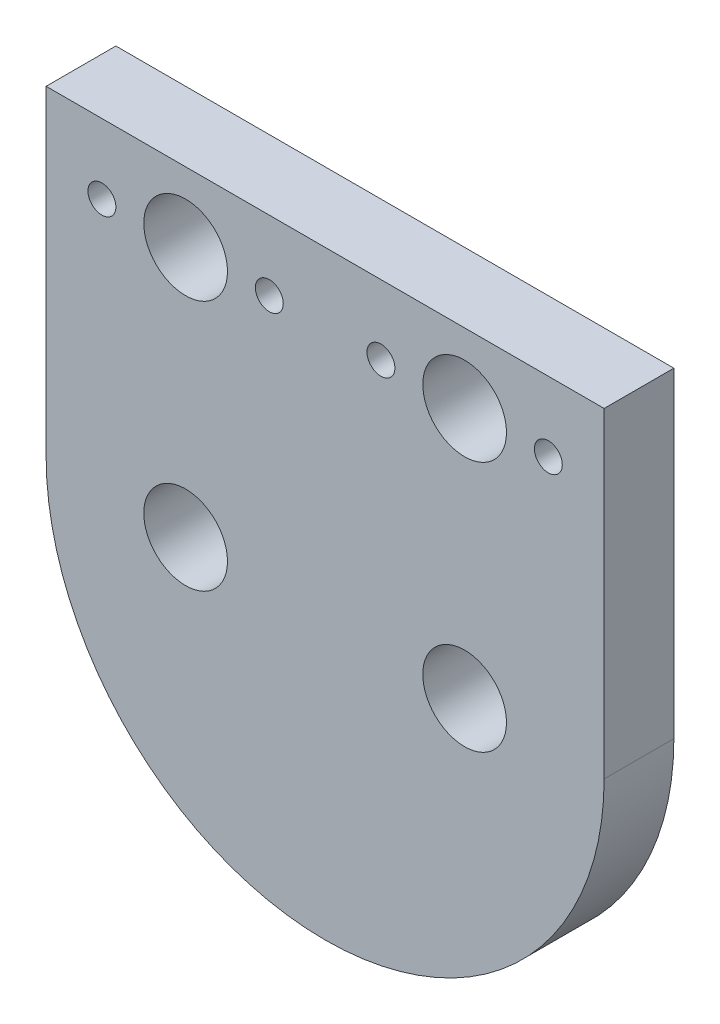
ISO-10303-21;
HEADER;
FILE_DESCRIPTION(('STEP AP214'),'2;1');
FILE_NAME('part.step','',(''),(''),'','','');
FILE_SCHEMA(('AUTOMOTIVE_DESIGN { 1 0 10303 214 1 1 1 1 }'));
ENDSEC;
DATA;
#1=APPLICATION_CONTEXT('core data for automotive mechanical design processes');
#2=APPLICATION_PROTOCOL_DEFINITION('international standard','automotive_design',2000,#1);
#3=PRODUCT_CONTEXT('',#1,'mechanical');
#4=PRODUCT('Part','Part','',(#3));
#5=PRODUCT_RELATED_PRODUCT_CATEGORY('part','',(#4));
#6=PRODUCT_DEFINITION_FORMATION('','',#4);
#7=PRODUCT_DEFINITION_CONTEXT('part definition',#1,'design');
#8=PRODUCT_DEFINITION('design','',#6,#7);
#9=PRODUCT_DEFINITION_SHAPE('','',#8);
#10=(LENGTH_UNIT() NAMED_UNIT(*) SI_UNIT(.MILLI.,.METRE.));
#11=(NAMED_UNIT(*) PLANE_ANGLE_UNIT() SI_UNIT($,.RADIAN.));
#12=(NAMED_UNIT(*) SI_UNIT($,.STERADIAN.) SOLID_ANGLE_UNIT());
#13=UNCERTAINTY_MEASURE_WITH_UNIT(LENGTH_MEASURE(1.E-05),#10,'distance_accuracy_value','');
#14=(GEOMETRIC_REPRESENTATION_CONTEXT(3) GLOBAL_UNCERTAINTY_ASSIGNED_CONTEXT((#13)) GLOBAL_UNIT_ASSIGNED_CONTEXT((#10,
#11,#12)) REPRESENTATION_CONTEXT('',''));
#15=CARTESIAN_POINT('',(0.,0.,0.));
#16=DIRECTION('',(0.,0.,1.));
#17=DIRECTION('',(1.,0.,0.));
#18=AXIS2_PLACEMENT_3D('',#15,#16,#17);
#19=CARTESIAN_POINT('',(0.,0.,5.));
#20=DIRECTION('',(0.,0.,1.));
#21=DIRECTION('',(1.,0.,0.));
#22=AXIS2_PLACEMENT_3D('',#19,#20,#21);
#23=PLANE('',#22);
#24=CARTESIAN_POINT('',(4.,18.,5.));
#25=DIRECTION('',(0.,0.,1.));
#26=DIRECTION('',(1.,0.,0.));
#27=AXIS2_PLACEMENT_3D('',#24,#25,#26);
#28=CIRCLE('',#27,1.);
#29=CARTESIAN_POINT('',(5.,18.,5.));
#30=VERTEX_POINT('',#29);
#31=EDGE_CURVE('E145',#30,#30,#28,.T.);
#32=ORIENTED_EDGE('',*,*,#31,.F.);
#33=EDGE_LOOP('',(#32));
#34=FACE_BOUND('',#33,.T.);
#35=CARTESIAN_POINT('',(-4.,18.,5.));
#36=DIRECTION('',(0.,0.,1.));
#37=DIRECTION('',(1.,0.,0.));
#38=AXIS2_PLACEMENT_3D('',#35,#36,#37);
#39=CIRCLE('',#38,1.);
#40=CARTESIAN_POINT('',(-3.,18.,5.));
#41=VERTEX_POINT('',#40);
#42=EDGE_CURVE('E133',#41,#41,#39,.T.);
#43=ORIENTED_EDGE('',*,*,#42,.F.);
#44=EDGE_LOOP('',(#43));
#45=FACE_BOUND('',#44,.T.);
#46=CARTESIAN_POINT('',(-10.,18.,5.));
#47=DIRECTION('',(0.,0.,1.));
#48=DIRECTION('',(1.,0.,0.));
#49=AXIS2_PLACEMENT_3D('',#46,#47,#48);
#50=CIRCLE('',#49,3.);
#51=CARTESIAN_POINT('',(-7.,18.,5.));
#52=VERTEX_POINT('',#51);
#53=EDGE_CURVE('E121',#52,#52,#50,.T.);
#54=ORIENTED_EDGE('',*,*,#53,.F.);
#55=EDGE_LOOP('',(#54));
#56=FACE_BOUND('',#55,.T.);
#57=CARTESIAN_POINT('',(10.,0.,5.));
#58=DIRECTION('',(0.,0.,1.));
#59=DIRECTION('',(1.,0.,0.));
#60=AXIS2_PLACEMENT_3D('',#57,#58,#59);
#61=CIRCLE('',#60,3.);
#62=CARTESIAN_POINT('',(13.,0.,5.));
#63=VERTEX_POINT('',#62);
#64=EDGE_CURVE('E100',#63,#63,#61,.T.);
#65=ORIENTED_EDGE('',*,*,#64,.F.);
#66=EDGE_LOOP('',(#65));
#67=FACE_BOUND('',#66,.T.);
#68=CARTESIAN_POINT('',(0.,0.,5.));
#69=DIRECTION('',(0.,0.,1.));
#70=DIRECTION('',(1.,0.,0.));
#71=AXIS2_PLACEMENT_3D('',#68,#69,#70);
#72=CIRCLE('',#71,20.);
#73=CARTESIAN_POINT('',(-20.,0.,5.));
#74=VERTEX_POINT('',#73);
#75=CARTESIAN_POINT('',(20.,0.,5.));
#76=VERTEX_POINT('',#75);
#77=EDGE_CURVE('E85',#74,#76,#72,.T.);
#78=ORIENTED_EDGE('',*,*,#77,.T.);
#79=DIRECTION('',(0.,1.,0.));
#80=VECTOR('',#79,1.);
#81=CARTESIAN_POINT('',(20.,0.,5.));
#82=LINE('',#81,#80);
#83=CARTESIAN_POINT('',(20.,23.,5.));
#84=VERTEX_POINT('',#83);
#85=EDGE_CURVE('E80',#76,#84,#82,.T.);
#86=ORIENTED_EDGE('',*,*,#85,.T.);
#87=DIRECTION('',(-1.,0.,0.));
#88=VECTOR('',#87,1.);
#89=CARTESIAN_POINT('',(-20.,23.,5.));
#90=LINE('',#89,#88);
#91=CARTESIAN_POINT('',(-20.,23.,5.));
#92=VERTEX_POINT('',#91);
#93=EDGE_CURVE('E83',#84,#92,#90,.T.);
#94=ORIENTED_EDGE('',*,*,#93,.T.);
#95=DIRECTION('',(0.,-1.,0.));
#96=VECTOR('',#95,1.);
#97=CARTESIAN_POINT('',(-20.,0.,5.));
#98=LINE('',#97,#96);
#99=EDGE_CURVE('E50',#92,#74,#98,.T.);
#100=ORIENTED_EDGE('',*,*,#99,.T.);
#101=EDGE_LOOP('',(#78,#86,#94,#100));
#102=FACE_BOUND('',#101,.T.);
#103=CARTESIAN_POINT('',(-10.,0.,5.));
#104=DIRECTION('',(0.,0.,1.));
#105=DIRECTION('',(1.,0.,0.));
#106=AXIS2_PLACEMENT_3D('',#103,#104,#105);
#107=CIRCLE('',#106,3.);
#108=CARTESIAN_POINT('',(-7.,0.,5.));
#109=VERTEX_POINT('',#108);
#110=EDGE_CURVE('E115',#109,#109,#107,.T.);
#111=ORIENTED_EDGE('',*,*,#110,.F.);
#112=EDGE_LOOP('',(#111));
#113=FACE_BOUND('',#112,.T.);
#114=CARTESIAN_POINT('',(10.,18.,5.));
#115=DIRECTION('',(0.,0.,1.));
#116=DIRECTION('',(1.,0.,0.));
#117=AXIS2_PLACEMENT_3D('',#114,#115,#116);
#118=CIRCLE('',#117,3.);
#119=CARTESIAN_POINT('',(13.,18.,5.));
#120=VERTEX_POINT('',#119);
#121=EDGE_CURVE('E127',#120,#120,#118,.T.);
#122=ORIENTED_EDGE('',*,*,#121,.F.);
#123=EDGE_LOOP('',(#122));
#124=FACE_BOUND('',#123,.T.);
#125=CARTESIAN_POINT('',(-16.,18.,5.));
#126=DIRECTION('',(0.,0.,1.));
#127=DIRECTION('',(1.,0.,0.));
#128=AXIS2_PLACEMENT_3D('',#125,#126,#127);
#129=CIRCLE('',#128,1.);
#130=CARTESIAN_POINT('',(-15.,18.,5.));
#131=VERTEX_POINT('',#130);
#132=EDGE_CURVE('E139',#131,#131,#129,.T.);
#133=ORIENTED_EDGE('',*,*,#132,.F.);
#134=EDGE_LOOP('',(#133));
#135=FACE_BOUND('',#134,.T.);
#136=CARTESIAN_POINT('',(16.,18.,5.));
#137=DIRECTION('',(0.,0.,1.));
#138=DIRECTION('',(1.,0.,0.));
#139=AXIS2_PLACEMENT_3D('',#136,#137,#138);
#140=CIRCLE('',#139,1.);
#141=CARTESIAN_POINT('',(17.,18.,5.));
#142=VERTEX_POINT('',#141);
#143=EDGE_CURVE('E151',#142,#142,#140,.T.);
#144=ORIENTED_EDGE('',*,*,#143,.F.);
#145=EDGE_LOOP('',(#144));
#146=FACE_BOUND('',#145,.T.);
#147=ADVANCED_FACE('F33',(#34,#45,#56,#67,#102,#113,#124,#135,#146),#23,.T.);
#148=CARTESIAN_POINT('',(0.,0.,0.));
#149=DIRECTION('',(0.,0.,1.));
#150=DIRECTION('',(1.,0.,0.));
#151=AXIS2_PLACEMENT_3D('',#148,#149,#150);
#152=PLANE('',#151);
#153=CARTESIAN_POINT('',(0.,0.,0.));
#154=DIRECTION('',(0.,0.,1.));
#155=DIRECTION('',(1.,0.,0.));
#156=AXIS2_PLACEMENT_3D('',#153,#154,#155);
#157=CIRCLE('',#156,20.);
#158=CARTESIAN_POINT('',(-20.,0.,0.));
#159=VERTEX_POINT('',#158);
#160=CARTESIAN_POINT('',(20.,0.,0.));
#161=VERTEX_POINT('',#160);
#162=EDGE_CURVE('E97',#159,#161,#157,.T.);
#163=ORIENTED_EDGE('',*,*,#162,.F.);
#164=DIRECTION('',(0.,-1.,0.));
#165=VECTOR('',#164,1.);
#166=CARTESIAN_POINT('',(-20.,0.,0.));
#167=LINE('',#166,#165);
#168=CARTESIAN_POINT('',(-20.,23.,0.));
#169=VERTEX_POINT('',#168);
#170=EDGE_CURVE('E73',#169,#159,#167,.T.);
#171=ORIENTED_EDGE('',*,*,#170,.F.);
#172=DIRECTION('',(-1.,0.,0.));
#173=VECTOR('',#172,1.);
#174=CARTESIAN_POINT('',(-20.,23.,0.));
#175=LINE('',#174,#173);
#176=CARTESIAN_POINT('',(20.,23.,0.));
#177=VERTEX_POINT('',#176);
#178=EDGE_CURVE('E67',#177,#169,#175,.T.);
#179=ORIENTED_EDGE('',*,*,#178,.F.);
#180=DIRECTION('',(0.,1.,0.));
#181=VECTOR('',#180,1.);
#182=CARTESIAN_POINT('',(20.,0.,0.));
#183=LINE('',#182,#181);
#184=EDGE_CURVE('E89',#161,#177,#183,.T.);
#185=ORIENTED_EDGE('',*,*,#184,.F.);
#186=EDGE_LOOP('',(#163,#171,#179,#185));
#187=FACE_BOUND('',#186,.T.);
#188=CARTESIAN_POINT('',(10.,0.,0.));
#189=DIRECTION('',(0.,0.,1.));
#190=DIRECTION('',(1.,0.,0.));
#191=AXIS2_PLACEMENT_3D('',#188,#189,#190);
#192=CIRCLE('',#191,3.);
#193=CARTESIAN_POINT('',(13.,0.,0.));
#194=VERTEX_POINT('',#193);
#195=EDGE_CURVE('E112',#194,#194,#192,.T.);
#196=ORIENTED_EDGE('',*,*,#195,.T.);
#197=EDGE_LOOP('',(#196));
#198=FACE_BOUND('',#197,.T.);
#199=CARTESIAN_POINT('',(-10.,0.,0.));
#200=DIRECTION('',(0.,0.,1.));
#201=DIRECTION('',(1.,0.,0.));
#202=AXIS2_PLACEMENT_3D('',#199,#200,#201);
#203=CIRCLE('',#202,3.);
#204=CARTESIAN_POINT('',(-7.,0.,0.));
#205=VERTEX_POINT('',#204);
#206=EDGE_CURVE('E118',#205,#205,#203,.T.);
#207=ORIENTED_EDGE('',*,*,#206,.T.);
#208=EDGE_LOOP('',(#207));
#209=FACE_BOUND('',#208,.T.);
#210=CARTESIAN_POINT('',(-10.,18.,0.));
#211=DIRECTION('',(0.,0.,1.));
#212=DIRECTION('',(1.,0.,0.));
#213=AXIS2_PLACEMENT_3D('',#210,#211,#212);
#214=CIRCLE('',#213,3.);
#215=CARTESIAN_POINT('',(-7.,18.,0.));
#216=VERTEX_POINT('',#215);
#217=EDGE_CURVE('E124',#216,#216,#214,.T.);
#218=ORIENTED_EDGE('',*,*,#217,.T.);
#219=EDGE_LOOP('',(#218));
#220=FACE_BOUND('',#219,.T.);
#221=CARTESIAN_POINT('',(10.,18.,0.));
#222=DIRECTION('',(0.,0.,1.));
#223=DIRECTION('',(1.,0.,0.));
#224=AXIS2_PLACEMENT_3D('',#221,#222,#223);
#225=CIRCLE('',#224,3.);
#226=CARTESIAN_POINT('',(13.,18.,0.));
#227=VERTEX_POINT('',#226);
#228=EDGE_CURVE('E130',#227,#227,#225,.T.);
#229=ORIENTED_EDGE('',*,*,#228,.T.);
#230=EDGE_LOOP('',(#229));
#231=FACE_BOUND('',#230,.T.);
#232=CARTESIAN_POINT('',(-4.,18.,0.));
#233=DIRECTION('',(0.,0.,1.));
#234=DIRECTION('',(1.,0.,0.));
#235=AXIS2_PLACEMENT_3D('',#232,#233,#234);
#236=CIRCLE('',#235,1.);
#237=CARTESIAN_POINT('',(-3.,18.,0.));
#238=VERTEX_POINT('',#237);
#239=EDGE_CURVE('E136',#238,#238,#236,.T.);
#240=ORIENTED_EDGE('',*,*,#239,.T.);
#241=EDGE_LOOP('',(#240));
#242=FACE_BOUND('',#241,.T.);
#243=CARTESIAN_POINT('',(-16.,18.,0.));
#244=DIRECTION('',(0.,0.,1.));
#245=DIRECTION('',(1.,0.,0.));
#246=AXIS2_PLACEMENT_3D('',#243,#244,#245);
#247=CIRCLE('',#246,1.);
#248=CARTESIAN_POINT('',(-15.,18.,0.));
#249=VERTEX_POINT('',#248);
#250=EDGE_CURVE('E142',#249,#249,#247,.T.);
#251=ORIENTED_EDGE('',*,*,#250,.T.);
#252=EDGE_LOOP('',(#251));
#253=FACE_BOUND('',#252,.T.);
#254=CARTESIAN_POINT('',(4.,18.,0.));
#255=DIRECTION('',(0.,0.,1.));
#256=DIRECTION('',(1.,0.,0.));
#257=AXIS2_PLACEMENT_3D('',#254,#255,#256);
#258=CIRCLE('',#257,1.);
#259=CARTESIAN_POINT('',(5.,18.,0.));
#260=VERTEX_POINT('',#259);
#261=EDGE_CURVE('E148',#260,#260,#258,.T.);
#262=ORIENTED_EDGE('',*,*,#261,.T.);
#263=EDGE_LOOP('',(#262));
#264=FACE_BOUND('',#263,.T.);
#265=CARTESIAN_POINT('',(16.,18.,0.));
#266=DIRECTION('',(0.,0.,1.));
#267=DIRECTION('',(1.,0.,0.));
#268=AXIS2_PLACEMENT_3D('',#265,#266,#267);
#269=CIRCLE('',#268,1.);
#270=CARTESIAN_POINT('',(17.,18.,0.));
#271=VERTEX_POINT('',#270);
#272=EDGE_CURVE('E154',#271,#271,#269,.T.);
#273=ORIENTED_EDGE('',*,*,#272,.T.);
#274=EDGE_LOOP('',(#273));
#275=FACE_BOUND('',#274,.T.);
#276=ADVANCED_FACE('F108',(#187,#198,#209,#220,#231,#242,#253,#264,#275),#152,.F.);
#277=CARTESIAN_POINT('',(0.,0.,5.));
#278=DIRECTION('',(0.,0.,-1.));
#279=DIRECTION('',(-1.,0.,0.));
#280=AXIS2_PLACEMENT_3D('',#277,#278,#279);
#281=CYLINDRICAL_SURFACE('',#280,20.);
#282=ORIENTED_EDGE('',*,*,#162,.T.);
#283=DIRECTION('',(0.,0.,-1.));
#284=VECTOR('',#283,1.);
#285=CARTESIAN_POINT('',(20.,0.,5.));
#286=LINE('',#285,#284);
#287=EDGE_CURVE('E11',#76,#161,#286,.T.);
#288=ORIENTED_EDGE('',*,*,#287,.F.);
#289=ORIENTED_EDGE('',*,*,#77,.F.);
#290=DIRECTION('',(0.,0.,-1.));
#291=VECTOR('',#290,1.);
#292=CARTESIAN_POINT('',(-20.,0.,5.));
#293=LINE('',#292,#291);
#294=EDGE_CURVE('E93',#74,#159,#293,.T.);
#295=ORIENTED_EDGE('',*,*,#294,.T.);
#296=EDGE_LOOP('',(#282,#288,#289,#295));
#297=FACE_BOUND('',#296,.T.);
#298=ADVANCED_FACE('F35',(#297),#281,.T.);
#299=CARTESIAN_POINT('',(20.,0.,5.));
#300=DIRECTION('',(-1.,0.,0.));
#301=DIRECTION('',(0.,0.,1.));
#302=AXIS2_PLACEMENT_3D('',#299,#300,#301);
#303=PLANE('',#302);
#304=ORIENTED_EDGE('',*,*,#184,.T.);
#305=DIRECTION('',(0.,0.,-1.));
#306=VECTOR('',#305,1.);
#307=CARTESIAN_POINT('',(20.,23.,5.));
#308=LINE('',#307,#306);
#309=EDGE_CURVE('E42',#84,#177,#308,.T.);
#310=ORIENTED_EDGE('',*,*,#309,.F.);
#311=ORIENTED_EDGE('',*,*,#85,.F.);
#312=ORIENTED_EDGE('',*,*,#287,.T.);
#313=EDGE_LOOP('',(#304,#310,#311,#312));
#314=FACE_BOUND('',#313,.T.);
#315=ADVANCED_FACE('F88',(#314),#303,.F.);
#316=CARTESIAN_POINT('',(-20.,23.,5.));
#317=DIRECTION('',(0.,-1.,0.));
#318=DIRECTION('',(0.,0.,-1.));
#319=AXIS2_PLACEMENT_3D('',#316,#317,#318);
#320=PLANE('',#319);
#321=ORIENTED_EDGE('',*,*,#178,.T.);
#322=DIRECTION('',(0.,0.,-1.));
#323=VECTOR('',#322,1.);
#324=CARTESIAN_POINT('',(-20.,23.,5.));
#325=LINE('',#324,#323);
#326=EDGE_CURVE('E90',#92,#169,#325,.T.);
#327=ORIENTED_EDGE('',*,*,#326,.F.);
#328=ORIENTED_EDGE('',*,*,#93,.F.);
#329=ORIENTED_EDGE('',*,*,#309,.T.);
#330=EDGE_LOOP('',(#321,#327,#328,#329));
#331=FACE_BOUND('',#330,.T.);
#332=ADVANCED_FACE('F91',(#331),#320,.F.);
#333=CARTESIAN_POINT('',(-20.,0.,5.));
#334=DIRECTION('',(1.,0.,0.));
#335=DIRECTION('',(0.,0.,-1.));
#336=AXIS2_PLACEMENT_3D('',#333,#334,#335);
#337=PLANE('',#336);
#338=ORIENTED_EDGE('',*,*,#170,.T.);
#339=ORIENTED_EDGE('',*,*,#294,.F.);
#340=ORIENTED_EDGE('',*,*,#99,.F.);
#341=ORIENTED_EDGE('',*,*,#326,.T.);
#342=EDGE_LOOP('',(#338,#339,#340,#341));
#343=FACE_BOUND('',#342,.T.);
#344=ADVANCED_FACE('F105',(#343),#337,.F.);
#345=CARTESIAN_POINT('',(10.,0.,5.));
#346=DIRECTION('',(0.,0.,-1.));
#347=DIRECTION('',(-1.,0.,0.));
#348=AXIS2_PLACEMENT_3D('',#345,#346,#347);
#349=CYLINDRICAL_SURFACE('',#348,3.);
#350=ORIENTED_EDGE('',*,*,#64,.T.);
#351=EDGE_LOOP('',(#350));
#352=FACE_BOUND('',#351,.T.);
#353=ORIENTED_EDGE('',*,*,#195,.F.);
#354=EDGE_LOOP('',(#353));
#355=FACE_BOUND('',#354,.T.);
#356=ADVANCED_FACE('F173',(#352,#355),#349,.F.);
#357=CARTESIAN_POINT('',(-10.,0.,5.));
#358=DIRECTION('',(0.,0.,-1.));
#359=DIRECTION('',(-1.,0.,0.));
#360=AXIS2_PLACEMENT_3D('',#357,#358,#359);
#361=CYLINDRICAL_SURFACE('',#360,3.);
#362=ORIENTED_EDGE('',*,*,#110,.T.);
#363=EDGE_LOOP('',(#362));
#364=FACE_BOUND('',#363,.T.);
#365=ORIENTED_EDGE('',*,*,#206,.F.);
#366=EDGE_LOOP('',(#365));
#367=FACE_BOUND('',#366,.T.);
#368=ADVANCED_FACE('F219',(#364,#367),#361,.F.);
#369=CARTESIAN_POINT('',(-10.,18.,5.));
#370=DIRECTION('',(0.,0.,-1.));
#371=DIRECTION('',(-1.,0.,0.));
#372=AXIS2_PLACEMENT_3D('',#369,#370,#371);
#373=CYLINDRICAL_SURFACE('',#372,3.);
#374=ORIENTED_EDGE('',*,*,#53,.T.);
#375=EDGE_LOOP('',(#374));
#376=FACE_BOUND('',#375,.T.);
#377=ORIENTED_EDGE('',*,*,#217,.F.);
#378=EDGE_LOOP('',(#377));
#379=FACE_BOUND('',#378,.T.);
#380=ADVANCED_FACE('F227',(#376,#379),#373,.F.);
#381=CARTESIAN_POINT('',(10.,18.,5.));
#382=DIRECTION('',(0.,0.,-1.));
#383=DIRECTION('',(-1.,0.,0.));
#384=AXIS2_PLACEMENT_3D('',#381,#382,#383);
#385=CYLINDRICAL_SURFACE('',#384,3.);
#386=ORIENTED_EDGE('',*,*,#121,.T.);
#387=EDGE_LOOP('',(#386));
#388=FACE_BOUND('',#387,.T.);
#389=ORIENTED_EDGE('',*,*,#228,.F.);
#390=EDGE_LOOP('',(#389));
#391=FACE_BOUND('',#390,.T.);
#392=ADVANCED_FACE('F235',(#388,#391),#385,.F.);
#393=CARTESIAN_POINT('',(-4.,18.,5.));
#394=DIRECTION('',(0.,0.,-1.));
#395=DIRECTION('',(-1.,0.,0.));
#396=AXIS2_PLACEMENT_3D('',#393,#394,#395);
#397=CYLINDRICAL_SURFACE('',#396,1.);
#398=ORIENTED_EDGE('',*,*,#42,.T.);
#399=EDGE_LOOP('',(#398));
#400=FACE_BOUND('',#399,.T.);
#401=ORIENTED_EDGE('',*,*,#239,.F.);
#402=EDGE_LOOP('',(#401));
#403=FACE_BOUND('',#402,.T.);
#404=ADVANCED_FACE('F244',(#400,#403),#397,.F.);
#405=CARTESIAN_POINT('',(-16.,18.,5.));
#406=DIRECTION('',(0.,0.,-1.));
#407=DIRECTION('',(-1.,0.,0.));
#408=AXIS2_PLACEMENT_3D('',#405,#406,#407);
#409=CYLINDRICAL_SURFACE('',#408,1.);
#410=ORIENTED_EDGE('',*,*,#132,.T.);
#411=EDGE_LOOP('',(#410));
#412=FACE_BOUND('',#411,.T.);
#413=ORIENTED_EDGE('',*,*,#250,.F.);
#414=EDGE_LOOP('',(#413));
#415=FACE_BOUND('',#414,.T.);
#416=ADVANCED_FACE('F253',(#412,#415),#409,.F.);
#417=CARTESIAN_POINT('',(4.,18.,5.));
#418=DIRECTION('',(0.,0.,-1.));
#419=DIRECTION('',(-1.,0.,0.));
#420=AXIS2_PLACEMENT_3D('',#417,#418,#419);
#421=CYLINDRICAL_SURFACE('',#420,1.);
#422=ORIENTED_EDGE('',*,*,#31,.T.);
#423=EDGE_LOOP('',(#422));
#424=FACE_BOUND('',#423,.T.);
#425=ORIENTED_EDGE('',*,*,#261,.F.);
#426=EDGE_LOOP('',(#425));
#427=FACE_BOUND('',#426,.T.);
#428=ADVANCED_FACE('F262',(#424,#427),#421,.F.);
#429=CARTESIAN_POINT('',(16.,18.,5.));
#430=DIRECTION('',(0.,0.,-1.));
#431=DIRECTION('',(-1.,0.,0.));
#432=AXIS2_PLACEMENT_3D('',#429,#430,#431);
#433=CYLINDRICAL_SURFACE('',#432,1.);
#434=ORIENTED_EDGE('',*,*,#143,.T.);
#435=EDGE_LOOP('',(#434));
#436=FACE_BOUND('',#435,.T.);
#437=ORIENTED_EDGE('',*,*,#272,.F.);
#438=EDGE_LOOP('',(#437));
#439=FACE_BOUND('',#438,.T.);
#440=ADVANCED_FACE('F160',(#436,#439),#433,.F.);
#441=CLOSED_SHELL('',(#147,#276,#298,#315,#332,#344,#356,#368,#380,#392,#404,#416,#428,#440));
#442=MANIFOLD_SOLID_BREP('B2',#441);
#443=ADVANCED_BREP_SHAPE_REPRESENTATION('',(#18,#442),#14);
#444=SHAPE_DEFINITION_REPRESENTATION(#9,#443);
ENDSEC;
END-ISO-10303-21;
